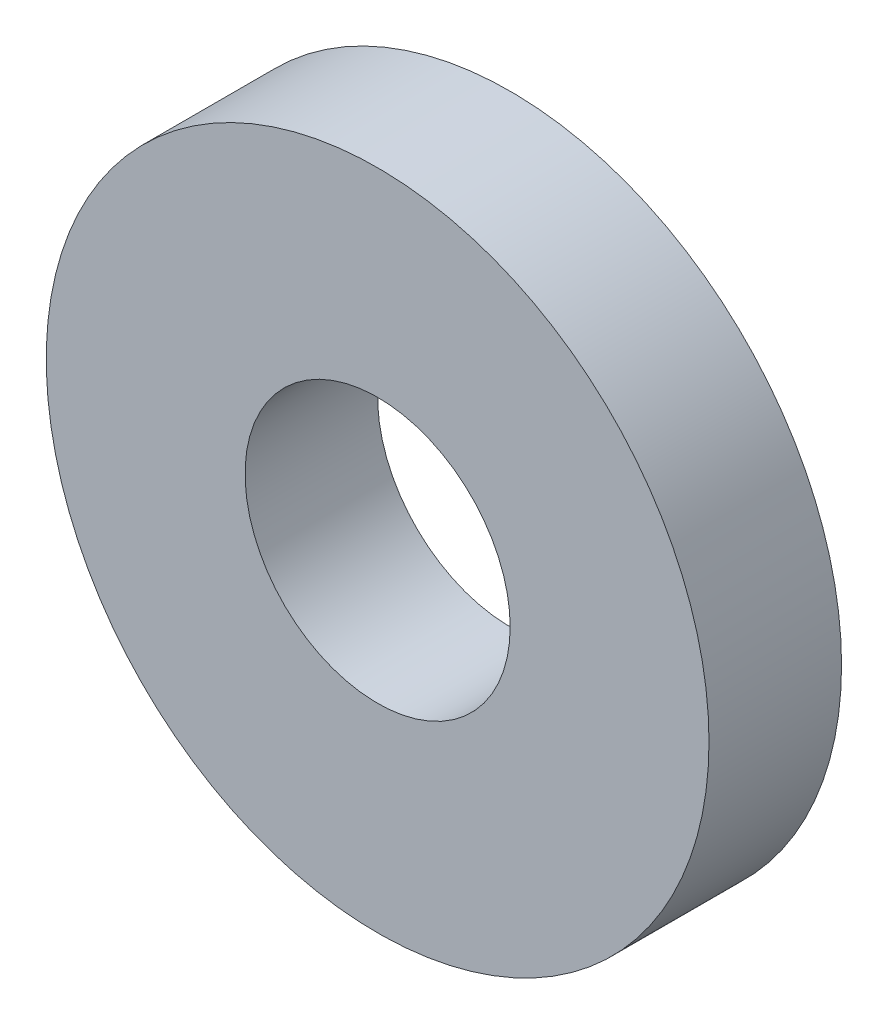
ISO-10303-21;
HEADER;
FILE_DESCRIPTION(('STEP AP214'),'2;1');
FILE_NAME('part.step','',(''),(''),'','','');
FILE_SCHEMA(('AUTOMOTIVE_DESIGN { 1 0 10303 214 1 1 1 1 }'));
ENDSEC;
DATA;
#1=APPLICATION_CONTEXT('core data for automotive mechanical design processes');
#2=APPLICATION_PROTOCOL_DEFINITION('international standard','automotive_design',2000,#1);
#3=PRODUCT_CONTEXT('',#1,'mechanical');
#4=PRODUCT('Part','Part','',(#3));
#5=PRODUCT_RELATED_PRODUCT_CATEGORY('part','',(#4));
#6=PRODUCT_DEFINITION_FORMATION('','',#4);
#7=PRODUCT_DEFINITION_CONTEXT('part definition',#1,'design');
#8=PRODUCT_DEFINITION('design','',#6,#7);
#9=PRODUCT_DEFINITION_SHAPE('','',#8);
#10=(LENGTH_UNIT() NAMED_UNIT(*) SI_UNIT(.MILLI.,.METRE.));
#11=(NAMED_UNIT(*) PLANE_ANGLE_UNIT() SI_UNIT($,.RADIAN.));
#12=(NAMED_UNIT(*) SI_UNIT($,.STERADIAN.) SOLID_ANGLE_UNIT());
#13=UNCERTAINTY_MEASURE_WITH_UNIT(LENGTH_MEASURE(1.E-05),#10,'distance_accuracy_value','');
#14=(GEOMETRIC_REPRESENTATION_CONTEXT(3) GLOBAL_UNCERTAINTY_ASSIGNED_CONTEXT((#13)) GLOBAL_UNIT_ASSIGNED_CONTEXT((#10,
#11,#12)) REPRESENTATION_CONTEXT('',''));
#15=CARTESIAN_POINT('',(0.,0.,0.));
#16=DIRECTION('',(0.,0.,1.));
#17=DIRECTION('',(1.,0.,0.));
#18=AXIS2_PLACEMENT_3D('',#15,#16,#17);
#19=CARTESIAN_POINT('',(0.,0.,5.));
#20=DIRECTION('',(0.,0.,1.));
#21=DIRECTION('',(1.,0.,0.));
#22=AXIS2_PLACEMENT_3D('',#19,#20,#21);
#23=PLANE('',#22);
#24=CARTESIAN_POINT('',(0.,0.,5.));
#25=DIRECTION('',(0.,0.,1.));
#26=DIRECTION('',(1.,0.,0.));
#27=AXIS2_PLACEMENT_3D('',#24,#25,#26);
#28=CIRCLE('',#27,12.5);
#29=CARTESIAN_POINT('',(12.5,0.,5.));
#30=VERTEX_POINT('',#29);
#31=EDGE_CURVE('E10',#30,#30,#28,.T.);
#32=ORIENTED_EDGE('',*,*,#31,.T.);
#33=EDGE_LOOP('',(#32));
#34=FACE_BOUND('',#33,.T.);
#35=CARTESIAN_POINT('',(0.,0.,5.));
#36=DIRECTION('',(0.,0.,1.));
#37=DIRECTION('',(1.,0.,0.));
#38=AXIS2_PLACEMENT_3D('',#35,#36,#37);
#39=CIRCLE('',#38,5.);
#40=CARTESIAN_POINT('',(5.,0.,5.));
#41=VERTEX_POINT('',#40);
#42=EDGE_CURVE('E44',#41,#41,#39,.T.);
#43=ORIENTED_EDGE('',*,*,#42,.F.);
#44=EDGE_LOOP('',(#43));
#45=FACE_BOUND('',#44,.T.);
#46=ADVANCED_FACE('F33',(#34,#45),#23,.T.);
#47=CARTESIAN_POINT('',(0.,0.,0.));
#48=DIRECTION('',(0.,0.,1.));
#49=DIRECTION('',(1.,0.,0.));
#50=AXIS2_PLACEMENT_3D('',#47,#48,#49);
#51=PLANE('',#50);
#52=CARTESIAN_POINT('',(0.,0.,0.));
#53=DIRECTION('',(0.,0.,1.));
#54=DIRECTION('',(1.,0.,0.));
#55=AXIS2_PLACEMENT_3D('',#52,#53,#54);
#56=CIRCLE('',#55,12.5);
#57=CARTESIAN_POINT('',(12.5,0.,0.));
#58=VERTEX_POINT('',#57);
#59=EDGE_CURVE('E37',#58,#58,#56,.T.);
#60=ORIENTED_EDGE('',*,*,#59,.F.);
#61=EDGE_LOOP('',(#60));
#62=FACE_BOUND('',#61,.T.);
#63=CARTESIAN_POINT('',(0.,0.,0.));
#64=DIRECTION('',(0.,0.,1.));
#65=DIRECTION('',(1.,0.,0.));
#66=AXIS2_PLACEMENT_3D('',#63,#64,#65);
#67=CIRCLE('',#66,5.);
#68=CARTESIAN_POINT('',(5.,0.,0.));
#69=VERTEX_POINT('',#68);
#70=EDGE_CURVE('E46',#69,#69,#67,.T.);
#71=ORIENTED_EDGE('',*,*,#70,.T.);
#72=EDGE_LOOP('',(#71));
#73=FACE_BOUND('',#72,.T.);
#74=ADVANCED_FACE('F56',(#62,#73),#51,.F.);
#75=CARTESIAN_POINT('',(0.,0.,5.));
#76=DIRECTION('',(0.,0.,-1.));
#77=DIRECTION('',(-1.,0.,0.));
#78=AXIS2_PLACEMENT_3D('',#75,#76,#77);
#79=CYLINDRICAL_SURFACE('',#78,12.5);
#80=ORIENTED_EDGE('',*,*,#31,.F.);
#81=EDGE_LOOP('',(#80));
#82=FACE_BOUND('',#81,.T.);
#83=ORIENTED_EDGE('',*,*,#59,.T.);
#84=EDGE_LOOP('',(#83));
#85=FACE_BOUND('',#84,.T.);
#86=ADVANCED_FACE('F35',(#82,#85),#79,.T.);
#87=CARTESIAN_POINT('',(0.,0.,5.));
#88=DIRECTION('',(0.,0.,-1.));
#89=DIRECTION('',(-1.,0.,0.));
#90=AXIS2_PLACEMENT_3D('',#87,#88,#89);
#91=CYLINDRICAL_SURFACE('',#90,5.);
#92=ORIENTED_EDGE('',*,*,#42,.T.);
#93=EDGE_LOOP('',(#92));
#94=FACE_BOUND('',#93,.T.);
#95=ORIENTED_EDGE('',*,*,#70,.F.);
#96=EDGE_LOOP('',(#95));
#97=FACE_BOUND('',#96,.T.);
#98=ADVANCED_FACE('F52',(#94,#97),#91,.F.);
#99=CLOSED_SHELL('',(#46,#74,#86,#98));
#100=MANIFOLD_SOLID_BREP('B2',#99);
#101=ADVANCED_BREP_SHAPE_REPRESENTATION('',(#18,#100),#14);
#102=SHAPE_DEFINITION_REPRESENTATION(#9,#101);
ENDSEC;
END-ISO-10303-21;
